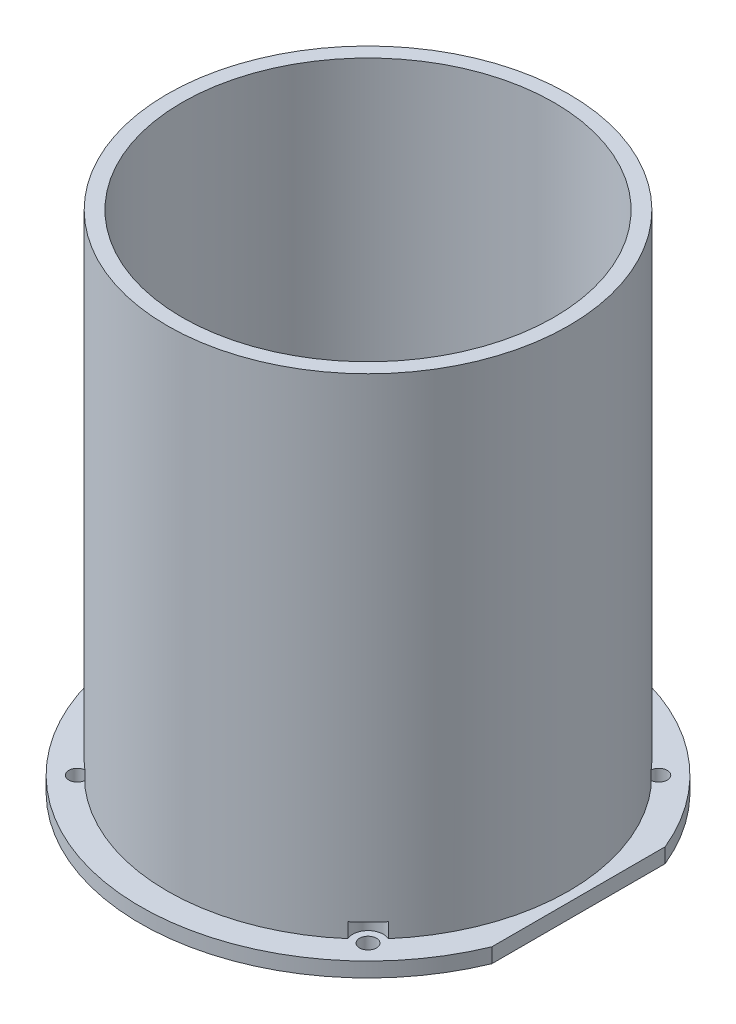
ISO-10303-21;
HEADER;
FILE_DESCRIPTION(('STEP AP214'),'2;1');
FILE_NAME('part.step','',(''),(''),'','','');
FILE_SCHEMA(('AUTOMOTIVE_DESIGN { 1 0 10303 214 1 1 1 1 }'));
ENDSEC;
DATA;
#1=APPLICATION_CONTEXT('core data for automotive mechanical design processes');
#2=APPLICATION_PROTOCOL_DEFINITION('international standard','automotive_design',2000,#1);
#3=PRODUCT_CONTEXT('',#1,'mechanical');
#4=PRODUCT('Part','Part','',(#3));
#5=PRODUCT_RELATED_PRODUCT_CATEGORY('part','',(#4));
#6=PRODUCT_DEFINITION_FORMATION('','',#4);
#7=PRODUCT_DEFINITION_CONTEXT('part definition',#1,'design');
#8=PRODUCT_DEFINITION('design','',#6,#7);
#9=PRODUCT_DEFINITION_SHAPE('','',#8);
#10=(LENGTH_UNIT() NAMED_UNIT(*) SI_UNIT(.MILLI.,.METRE.));
#11=(NAMED_UNIT(*) PLANE_ANGLE_UNIT() SI_UNIT($,.RADIAN.));
#12=(NAMED_UNIT(*) SI_UNIT($,.STERADIAN.) SOLID_ANGLE_UNIT());
#13=UNCERTAINTY_MEASURE_WITH_UNIT(LENGTH_MEASURE(1.E-05),#10,'distance_accuracy_value','');
#14=(GEOMETRIC_REPRESENTATION_CONTEXT(3) GLOBAL_UNCERTAINTY_ASSIGNED_CONTEXT((#13)) GLOBAL_UNIT_ASSIGNED_CONTEXT((#10,
#11,#12)) REPRESENTATION_CONTEXT('',''));
#15=CARTESIAN_POINT('',(0.,0.,0.));
#16=DIRECTION('',(0.,0.,1.));
#17=DIRECTION('',(1.,0.,0.));
#18=AXIS2_PLACEMENT_3D('',#15,#16,#17);
#19=CARTESIAN_POINT('',(0.,3.,0.));
#20=DIRECTION('',(0.,-1.,0.));
#21=DIRECTION('',(0.,0.,-1.));
#22=AXIS2_PLACEMENT_3D('',#19,#20,#21);
#23=CYLINDRICAL_SURFACE('',#22,38.);
#24=CARTESIAN_POINT('',(0.,0.,0.));
#25=DIRECTION('',(0.,1.,0.));
#26=DIRECTION('',(0.,0.,1.));
#27=AXIS2_PLACEMENT_3D('',#24,#25,#26);
#28=CIRCLE('',#27,38.);
#29=CARTESIAN_POINT('',(0.,0.,38.));
#30=VERTEX_POINT('',#29);
#31=EDGE_CURVE('E173',#30,#30,#28,.T.);
#32=ORIENTED_EDGE('',*,*,#31,.F.);
#33=EDGE_LOOP('',(#32));
#34=FACE_BOUND('',#33,.T.);
#35=CARTESIAN_POINT('',(0.,103.,0.));
#36=DIRECTION('',(0.,1.,0.));
#37=DIRECTION('',(0.,0.,1.));
#38=AXIS2_PLACEMENT_3D('',#35,#36,#37);
#39=CIRCLE('',#38,38.);
#40=CARTESIAN_POINT('',(0.,103.,38.));
#41=VERTEX_POINT('',#40);
#42=EDGE_CURVE('E319',#41,#41,#39,.T.);
#43=ORIENTED_EDGE('',*,*,#42,.T.);
#44=EDGE_LOOP('',(#43));
#45=FACE_BOUND('',#44,.T.);
#46=DIRECTION('',(0.,1.,0.));
#47=VECTOR('',#46,1.);
#48=CARTESIAN_POINT('',(-25.4481576781255,4.5,-28.2204052201463));
#49=LINE('',#48,#47);
#50=CARTESIAN_POINT('',(-25.4481576781255,1.,-28.2204052201463));
#51=VERTEX_POINT('',#50);
#52=CARTESIAN_POINT('',(-25.4481576781255,8.,-28.2204052201463));
#53=VERTEX_POINT('',#52);
#54=EDGE_CURVE('E195',#51,#53,#49,.T.);
#55=ORIENTED_EDGE('',*,*,#54,.F.);
#56=CARTESIAN_POINT('',(0.,1.,0.));
#57=DIRECTION('',(0.,1.,0.));
#58=DIRECTION('',(0.,0.,1.));
#59=AXIS2_PLACEMENT_3D('',#56,#57,#58);
#60=CIRCLE('',#59,38.);
#61=CARTESIAN_POINT('',(-28.2204052201463,1.,-25.4481576781255));
#62=VERTEX_POINT('',#61);
#63=EDGE_CURVE('E198',#51,#62,#60,.T.);
#64=ORIENTED_EDGE('',*,*,#63,.T.);
#65=DIRECTION('',(0.,1.,0.));
#66=VECTOR('',#65,1.);
#67=CARTESIAN_POINT('',(-28.2204052201463,4.5,-25.4481576781255));
#68=LINE('',#67,#66);
#69=CARTESIAN_POINT('',(-28.2204052201463,8.,-25.4481576781255));
#70=VERTEX_POINT('',#69);
#71=EDGE_CURVE('E192',#70,#62,#68,.F.);
#72=ORIENTED_EDGE('',*,*,#71,.F.);
#73=CARTESIAN_POINT('',(0.,8.,0.));
#74=DIRECTION('',(0.,1.,0.));
#75=DIRECTION('',(0.,0.,1.));
#76=AXIS2_PLACEMENT_3D('',#73,#74,#75);
#77=CIRCLE('',#76,38.);
#78=EDGE_CURVE('E189',#53,#70,#77,.T.);
#79=ORIENTED_EDGE('',*,*,#78,.F.);
#80=EDGE_LOOP('',(#55,#64,#72,#79));
#81=FACE_BOUND('',#80,.T.);
#82=DIRECTION('',(0.,1.,0.));
#83=VECTOR('',#82,1.);
#84=CARTESIAN_POINT('',(28.2204052201464,4.5,-25.4481576781254));
#85=LINE('',#84,#83);
#86=CARTESIAN_POINT('',(28.2204052201464,1.,-25.4481576781254));
#87=VERTEX_POINT('',#86);
#88=CARTESIAN_POINT('',(28.2204052201464,8.,-25.4481576781254));
#89=VERTEX_POINT('',#88);
#90=EDGE_CURVE('E248',#87,#89,#85,.T.);
#91=ORIENTED_EDGE('',*,*,#90,.F.);
#92=CARTESIAN_POINT('',(0.,1.,0.));
#93=DIRECTION('',(0.,1.,0.));
#94=DIRECTION('',(0.,0.,1.));
#95=AXIS2_PLACEMENT_3D('',#92,#93,#94);
#96=CIRCLE('',#95,38.);
#97=CARTESIAN_POINT('',(25.4481576781256,1.,-28.2204052201462));
#98=VERTEX_POINT('',#97);
#99=EDGE_CURVE('E212',#87,#98,#96,.T.);
#100=ORIENTED_EDGE('',*,*,#99,.T.);
#101=DIRECTION('',(0.,1.,0.));
#102=VECTOR('',#101,1.);
#103=CARTESIAN_POINT('',(25.4481576781256,4.5,-28.2204052201462));
#104=LINE('',#103,#102);
#105=CARTESIAN_POINT('',(25.4481576781256,8.,-28.2204052201462));
#106=VERTEX_POINT('',#105);
#107=EDGE_CURVE('E245',#106,#98,#104,.F.);
#108=ORIENTED_EDGE('',*,*,#107,.F.);
#109=CARTESIAN_POINT('',(0.,8.,0.));
#110=DIRECTION('',(0.,1.,0.));
#111=DIRECTION('',(0.,0.,1.));
#112=AXIS2_PLACEMENT_3D('',#109,#110,#111);
#113=CIRCLE('',#112,38.);
#114=EDGE_CURVE('E209',#89,#106,#113,.T.);
#115=ORIENTED_EDGE('',*,*,#114,.F.);
#116=EDGE_LOOP('',(#91,#100,#108,#115));
#117=FACE_BOUND('',#116,.T.);
#118=DIRECTION('',(0.,1.,0.));
#119=VECTOR('',#118,1.);
#120=CARTESIAN_POINT('',(25.4481576781255,4.5,28.2204052201463));
#121=LINE('',#120,#119);
#122=CARTESIAN_POINT('',(25.4481576781255,1.,28.2204052201463));
#123=VERTEX_POINT('',#122);
#124=CARTESIAN_POINT('',(25.4481576781255,8.,28.2204052201463));
#125=VERTEX_POINT('',#124);
#126=EDGE_CURVE('E219',#123,#125,#121,.T.);
#127=ORIENTED_EDGE('',*,*,#126,.F.);
#128=CARTESIAN_POINT('',(0.,1.,0.));
#129=DIRECTION('',(0.,1.,0.));
#130=DIRECTION('',(0.,0.,1.));
#131=AXIS2_PLACEMENT_3D('',#128,#129,#130);
#132=CIRCLE('',#131,38.);
#133=CARTESIAN_POINT('',(28.2204052201463,1.,25.4481576781255));
#134=VERTEX_POINT('',#133);
#135=EDGE_CURVE('E42',#123,#134,#132,.T.);
#136=ORIENTED_EDGE('',*,*,#135,.T.);
#137=DIRECTION('',(0.,1.,0.));
#138=VECTOR('',#137,1.);
#139=CARTESIAN_POINT('',(28.2204052201463,4.5,25.4481576781255));
#140=LINE('',#139,#138);
#141=CARTESIAN_POINT('',(28.2204052201463,8.,25.4481576781255));
#142=VERTEX_POINT('',#141);
#143=EDGE_CURVE('E216',#142,#134,#140,.F.);
#144=ORIENTED_EDGE('',*,*,#143,.F.);
#145=CARTESIAN_POINT('',(0.,8.,0.));
#146=DIRECTION('',(0.,1.,0.));
#147=DIRECTION('',(0.,0.,1.));
#148=AXIS2_PLACEMENT_3D('',#145,#146,#147);
#149=CIRCLE('',#148,38.);
#150=EDGE_CURVE('E237',#125,#142,#149,.T.);
#151=ORIENTED_EDGE('',*,*,#150,.F.);
#152=EDGE_LOOP('',(#127,#136,#144,#151));
#153=FACE_BOUND('',#152,.T.);
#154=DIRECTION('',(0.,1.,0.));
#155=VECTOR('',#154,1.);
#156=CARTESIAN_POINT('',(-28.2204052201466,4.5,25.4481576781252));
#157=LINE('',#156,#155);
#158=CARTESIAN_POINT('',(-28.2204052201466,1.,25.4481576781252));
#159=VERTEX_POINT('',#158);
#160=CARTESIAN_POINT('',(-28.2204052201466,8.,25.4481576781252));
#161=VERTEX_POINT('',#160);
#162=EDGE_CURVE('E56',#159,#161,#157,.T.);
#163=ORIENTED_EDGE('',*,*,#162,.F.);
#164=CARTESIAN_POINT('',(0.,1.,0.));
#165=DIRECTION('',(0.,1.,0.));
#166=DIRECTION('',(0.,0.,1.));
#167=AXIS2_PLACEMENT_3D('',#164,#165,#166);
#168=CIRCLE('',#167,38.);
#169=CARTESIAN_POINT('',(-25.4481576781258,1.,28.2204052201461));
#170=VERTEX_POINT('',#169);
#171=EDGE_CURVE('E11',#159,#170,#168,.T.);
#172=ORIENTED_EDGE('',*,*,#171,.T.);
#173=DIRECTION('',(0.,1.,0.));
#174=VECTOR('',#173,1.);
#175=CARTESIAN_POINT('',(-25.4481576781258,4.5,28.2204052201461));
#176=LINE('',#175,#174);
#177=CARTESIAN_POINT('',(-25.4481576781258,8.,28.2204052201461));
#178=VERTEX_POINT('',#177);
#179=EDGE_CURVE('E695',#178,#170,#176,.F.);
#180=ORIENTED_EDGE('',*,*,#179,.F.);
#181=CARTESIAN_POINT('',(0.,8.,0.));
#182=DIRECTION('',(0.,1.,0.));
#183=DIRECTION('',(0.,0.,1.));
#184=AXIS2_PLACEMENT_3D('',#181,#182,#183);
#185=CIRCLE('',#184,38.);
#186=EDGE_CURVE('E232',#161,#178,#185,.T.);
#187=ORIENTED_EDGE('',*,*,#186,.F.);
#188=EDGE_LOOP('',(#163,#172,#180,#187));
#189=FACE_BOUND('',#188,.T.);
#190=ADVANCED_FACE('F34',(#34,#45,#81,#117,#153,#189),#23,.F.);
#191=CARTESIAN_POINT('',(0.,103.,0.));
#192=DIRECTION('',(0.,-1.,0.));
#193=DIRECTION('',(0.,0.,-1.));
#194=AXIS2_PLACEMENT_3D('',#191,#192,#193);
#195=CYLINDRICAL_SURFACE('',#194,41.);
#196=DIRECTION('',(0.,-1.,0.));
#197=VECTOR('',#196,1.);
#198=CARTESIAN_POINT('',(-30.984716795134,4.5,26.8504622888572));
#199=LINE('',#198,#197);
#200=CARTESIAN_POINT('',(-30.984716795134,6.,26.8504622888572));
#201=VERTEX_POINT('',#200);
#202=CARTESIAN_POINT('',(-30.984716795134,3.,26.8504622888572));
#203=VERTEX_POINT('',#202);
#204=EDGE_CURVE('E271',#201,#203,#199,.T.);
#205=ORIENTED_EDGE('',*,*,#204,.F.);
#206=CARTESIAN_POINT('',(0.,6.00000000000001,0.));
#207=DIRECTION('',(0.,1.,0.));
#208=DIRECTION('',(0.,0.,1.));
#209=AXIS2_PLACEMENT_3D('',#206,#207,#208);
#210=CIRCLE('',#209,41.);
#211=CARTESIAN_POINT('',(-26.8504622888579,6.,30.9847167951334));
#212=VERTEX_POINT('',#211);
#213=EDGE_CURVE('E200',#201,#212,#210,.T.);
#214=ORIENTED_EDGE('',*,*,#213,.T.);
#215=DIRECTION('',(0.,-1.,0.));
#216=VECTOR('',#215,1.);
#217=CARTESIAN_POINT('',(-26.8504622888579,4.5,30.9847167951334));
#218=LINE('',#217,#216);
#219=CARTESIAN_POINT('',(-26.8504622888579,3.,30.9847167951334));
#220=VERTEX_POINT('',#219);
#221=EDGE_CURVE('E255',#220,#212,#218,.F.);
#222=ORIENTED_EDGE('',*,*,#221,.F.);
#223=CARTESIAN_POINT('',(0.,3.,0.));
#224=DIRECTION('',(0.,1.,0.));
#225=DIRECTION('',(0.,0.,1.));
#226=AXIS2_PLACEMENT_3D('',#223,#224,#225);
#227=CIRCLE('',#226,41.);
#228=CARTESIAN_POINT('',(26.8504622888576,3.,30.9847167951337));
#229=VERTEX_POINT('',#228);
#230=EDGE_CURVE('E325',#220,#229,#227,.T.);
#231=ORIENTED_EDGE('',*,*,#230,.T.);
#232=DIRECTION('',(0.,-1.,0.));
#233=VECTOR('',#232,1.);
#234=CARTESIAN_POINT('',(26.8504622888576,4.5,30.9847167951337));
#235=LINE('',#234,#233);
#236=CARTESIAN_POINT('',(26.8504622888576,6.,30.9847167951337));
#237=VERTEX_POINT('',#236);
#238=EDGE_CURVE('E276',#237,#229,#235,.T.);
#239=ORIENTED_EDGE('',*,*,#238,.F.);
#240=CARTESIAN_POINT('',(0.,6.00000000000001,0.));
#241=DIRECTION('',(0.,1.,0.));
#242=DIRECTION('',(0.,0.,1.));
#243=AXIS2_PLACEMENT_3D('',#240,#241,#242);
#244=CIRCLE('',#243,41.);
#245=CARTESIAN_POINT('',(30.9847167951337,6.,26.8504622888576));
#246=VERTEX_POINT('',#245);
#247=EDGE_CURVE('E203',#237,#246,#244,.T.);
#248=ORIENTED_EDGE('',*,*,#247,.T.);
#249=DIRECTION('',(0.,-1.,0.));
#250=VECTOR('',#249,1.);
#251=CARTESIAN_POINT('',(30.9847167951337,4.5,26.8504622888576));
#252=LINE('',#251,#250);
#253=CARTESIAN_POINT('',(30.9847167951337,3.,26.8504622888576));
#254=VERTEX_POINT('',#253);
#255=EDGE_CURVE('E274',#254,#246,#252,.F.);
#256=ORIENTED_EDGE('',*,*,#255,.F.);
#257=CARTESIAN_POINT('',(30.9847167951338,3.,-26.8504622888574));
#258=VERTEX_POINT('',#257);
#259=EDGE_CURVE('E326',#254,#258,#227,.T.);
#260=ORIENTED_EDGE('',*,*,#259,.T.);
#261=DIRECTION('',(0.,-1.,0.));
#262=VECTOR('',#261,1.);
#263=CARTESIAN_POINT('',(30.9847167951338,4.5,-26.8504622888574));
#264=LINE('',#263,#262);
#265=CARTESIAN_POINT('',(30.9847167951338,6.,-26.8504622888574));
#266=VERTEX_POINT('',#265);
#267=EDGE_CURVE('E281',#266,#258,#264,.T.);
#268=ORIENTED_EDGE('',*,*,#267,.F.);
#269=CARTESIAN_POINT('',(0.,6.00000000000001,0.));
#270=DIRECTION('',(0.,1.,0.));
#271=DIRECTION('',(0.,0.,1.));
#272=AXIS2_PLACEMENT_3D('',#269,#270,#271);
#273=CIRCLE('',#272,41.);
#274=CARTESIAN_POINT('',(26.8504622888577,6.,-30.9847167951336));
#275=VERTEX_POINT('',#274);
#276=EDGE_CURVE('E206',#266,#275,#273,.T.);
#277=ORIENTED_EDGE('',*,*,#276,.T.);
#278=DIRECTION('',(0.,-1.,0.));
#279=VECTOR('',#278,1.);
#280=CARTESIAN_POINT('',(26.8504622888577,4.5,-30.9847167951336));
#281=LINE('',#280,#279);
#282=CARTESIAN_POINT('',(26.8504622888577,3.,-30.9847167951336));
#283=VERTEX_POINT('',#282);
#284=EDGE_CURVE('E279',#283,#275,#281,.F.);
#285=ORIENTED_EDGE('',*,*,#284,.F.);
#286=CARTESIAN_POINT('',(-26.8504622888576,3.,-30.9847167951337));
#287=VERTEX_POINT('',#286);
#288=EDGE_CURVE('E331',#283,#287,#227,.T.);
#289=ORIENTED_EDGE('',*,*,#288,.T.);
#290=DIRECTION('',(0.,-1.,0.));
#291=VECTOR('',#290,1.);
#292=CARTESIAN_POINT('',(-26.8504622888576,4.5,-30.9847167951337));
#293=LINE('',#292,#291);
#294=CARTESIAN_POINT('',(-26.8504622888576,6.,-30.9847167951337));
#295=VERTEX_POINT('',#294);
#296=EDGE_CURVE('E186',#295,#287,#293,.T.);
#297=ORIENTED_EDGE('',*,*,#296,.F.);
#298=CARTESIAN_POINT('',(0.,6.00000000000001,0.));
#299=DIRECTION('',(0.,1.,0.));
#300=DIRECTION('',(0.,0.,1.));
#301=AXIS2_PLACEMENT_3D('',#298,#299,#300);
#302=CIRCLE('',#301,41.);
#303=CARTESIAN_POINT('',(-30.9847167951337,6.,-26.8504622888576));
#304=VERTEX_POINT('',#303);
#305=EDGE_CURVE('E181',#295,#304,#302,.T.);
#306=ORIENTED_EDGE('',*,*,#305,.T.);
#307=DIRECTION('',(0.,-1.,0.));
#308=VECTOR('',#307,1.);
#309=CARTESIAN_POINT('',(-30.9847167951337,4.5,-26.8504622888576));
#310=LINE('',#309,#308);
#311=CARTESIAN_POINT('',(-30.9847167951337,3.,-26.8504622888576));
#312=VERTEX_POINT('',#311);
#313=EDGE_CURVE('E184',#312,#304,#310,.F.);
#314=ORIENTED_EDGE('',*,*,#313,.F.);
#315=EDGE_CURVE('E322',#312,#203,#227,.T.);
#316=ORIENTED_EDGE('',*,*,#315,.T.);
#317=EDGE_LOOP('',(#205,#214,#222,#231,#239,#248,#256,#260,#268,#277,#285,#289,#297,#306,#314,#316));
#318=FACE_BOUND('',#317,.T.);
#319=CARTESIAN_POINT('',(0.,103.,0.));
#320=DIRECTION('',(0.,1.,0.));
#321=DIRECTION('',(0.,0.,1.));
#322=AXIS2_PLACEMENT_3D('',#319,#320,#321);
#323=CIRCLE('',#322,41.);
#324=CARTESIAN_POINT('',(0.,103.,41.));
#325=VERTEX_POINT('',#324);
#326=EDGE_CURVE('E178',#325,#325,#323,.T.);
#327=ORIENTED_EDGE('',*,*,#326,.F.);
#328=EDGE_LOOP('',(#327));
#329=FACE_BOUND('',#328,.T.);
#330=ADVANCED_FACE('F338',(#318,#329),#195,.T.);
#331=CARTESIAN_POINT('',(0.,3.,0.));
#332=DIRECTION('',(0.,1.,0.));
#333=DIRECTION('',(0.,0.,1.));
#334=AXIS2_PLACEMENT_3D('',#331,#332,#333);
#335=PLANE('',#334);
#336=DIRECTION('',(0.,0.,1.));
#337=VECTOR('',#336,1.);
#338=CARTESIAN_POINT('',(43.,3.,17.6988700204279));
#339=LINE('',#338,#337);
#340=CARTESIAN_POINT('',(43.,3.,-17.6988700204279));
#341=VERTEX_POINT('',#340);
#342=CARTESIAN_POINT('',(43.,3.,17.6988700204279));
#343=VERTEX_POINT('',#342);
#344=EDGE_CURVE('E49',#341,#343,#339,.T.);
#345=ORIENTED_EDGE('',*,*,#344,.F.);
#346=CARTESIAN_POINT('',(0.,3.,0.));
#347=DIRECTION('',(0.,1.,0.));
#348=DIRECTION('',(0.,0.,1.));
#349=AXIS2_PLACEMENT_3D('',#346,#347,#348);
#350=CIRCLE('',#349,46.5);
#351=EDGE_CURVE('E169',#341,#343,#350,.T.);
#352=ORIENTED_EDGE('',*,*,#351,.T.);
#353=EDGE_LOOP('',(#345,#352));
#354=FACE_BOUND('',#353,.T.);
#355=CARTESIAN_POINT('',(29.698484809835,3.,-29.698484809835));
#356=DIRECTION('',(0.,1.,0.));
#357=DIRECTION('',(0.,0.,1.));
#358=AXIS2_PLACEMENT_3D('',#355,#356,#357);
#359=CIRCLE('',#358,1.7272);
#360=CARTESIAN_POINT('',(29.698484809835,3.,-27.971284809835));
#361=VERTEX_POINT('',#360);
#362=EDGE_CURVE('E302',#361,#361,#359,.T.);
#363=ORIENTED_EDGE('',*,*,#362,.F.);
#364=EDGE_LOOP('',(#363));
#365=FACE_BOUND('',#364,.T.);
#366=ORIENTED_EDGE('',*,*,#259,.F.);
#367=CARTESIAN_POINT('',(29.698484809835,3.,29.698484809835));
#368=DIRECTION('',(0.,1.,0.));
#369=DIRECTION('',(0.,0.,-1.));
#370=AXIS2_PLACEMENT_3D('',#367,#368,#369);
#371=CIRCLE('',#370,3.125);
#372=EDGE_CURVE('E262',#254,#229,#371,.T.);
#373=ORIENTED_EDGE('',*,*,#372,.T.);
#374=ORIENTED_EDGE('',*,*,#230,.F.);
#375=CARTESIAN_POINT('',(-29.6984848098353,3.,29.6984848098347));
#376=DIRECTION('',(0.,1.,0.));
#377=DIRECTION('',(1.,0.,0.));
#378=AXIS2_PLACEMENT_3D('',#375,#376,#377);
#379=CIRCLE('',#378,3.125);
#380=EDGE_CURVE('E251',#220,#203,#379,.T.);
#381=ORIENTED_EDGE('',*,*,#380,.T.);
#382=ORIENTED_EDGE('',*,*,#315,.F.);
#383=CARTESIAN_POINT('',(-29.698484809835,3.,-29.698484809835));
#384=DIRECTION('',(0.,1.,0.));
#385=DIRECTION('',(0.,0.,1.));
#386=AXIS2_PLACEMENT_3D('',#383,#384,#385);
#387=CIRCLE('',#386,3.125);
#388=EDGE_CURVE('E290',#312,#287,#387,.T.);
#389=ORIENTED_EDGE('',*,*,#388,.T.);
#390=ORIENTED_EDGE('',*,*,#288,.F.);
#391=CARTESIAN_POINT('',(29.6984848098351,3.,-29.6984848098349));
#392=DIRECTION('',(0.,1.,0.));
#393=DIRECTION('',(-1.,0.,0.));
#394=AXIS2_PLACEMENT_3D('',#391,#392,#393);
#395=CIRCLE('',#394,3.125);
#396=EDGE_CURVE('E256',#283,#258,#395,.T.);
#397=ORIENTED_EDGE('',*,*,#396,.T.);
#398=EDGE_LOOP('',(#366,#373,#374,#381,#382,#389,#390,#397));
#399=FACE_BOUND('',#398,.T.);
#400=CARTESIAN_POINT('',(-29.698484809835,3.,29.698484809835));
#401=DIRECTION('',(0.,1.,0.));
#402=DIRECTION('',(0.,0.,1.));
#403=AXIS2_PLACEMENT_3D('',#400,#401,#402);
#404=CIRCLE('',#403,1.7272);
#405=CARTESIAN_POINT('',(-29.698484809835,3.,31.425684809835));
#406=VERTEX_POINT('',#405);
#407=EDGE_CURVE('E175',#406,#406,#404,.T.);
#408=ORIENTED_EDGE('',*,*,#407,.F.);
#409=EDGE_LOOP('',(#408));
#410=FACE_BOUND('',#409,.T.);
#411=CARTESIAN_POINT('',(29.698484809835,3.,29.698484809835));
#412=DIRECTION('',(0.,1.,0.));
#413=DIRECTION('',(0.,0.,1.));
#414=AXIS2_PLACEMENT_3D('',#411,#412,#413);
#415=CIRCLE('',#414,1.7272);
#416=CARTESIAN_POINT('',(29.698484809835,3.,31.425684809835));
#417=VERTEX_POINT('',#416);
#418=EDGE_CURVE('E308',#417,#417,#415,.T.);
#419=ORIENTED_EDGE('',*,*,#418,.F.);
#420=EDGE_LOOP('',(#419));
#421=FACE_BOUND('',#420,.T.);
#422=CARTESIAN_POINT('',(-29.698484809835,3.,-29.698484809835));
#423=DIRECTION('',(0.,1.,0.));
#424=DIRECTION('',(0.,0.,1.));
#425=AXIS2_PLACEMENT_3D('',#422,#423,#424);
#426=CIRCLE('',#425,1.7272);
#427=CARTESIAN_POINT('',(-29.698484809835,3.,-27.971284809835));
#428=VERTEX_POINT('',#427);
#429=EDGE_CURVE('E294',#428,#428,#426,.T.);
#430=ORIENTED_EDGE('',*,*,#429,.F.);
#431=EDGE_LOOP('',(#430));
#432=FACE_BOUND('',#431,.T.);
#433=ADVANCED_FACE('F345',(#354,#365,#399,#410,#421,#432),#335,.T.);
#434=CARTESIAN_POINT('',(0.,0.,0.));
#435=DIRECTION('',(0.,1.,0.));
#436=DIRECTION('',(0.,0.,1.));
#437=AXIS2_PLACEMENT_3D('',#434,#435,#436);
#438=PLANE('',#437);
#439=CARTESIAN_POINT('',(-29.698484809835,0.,-29.698484809835));
#440=DIRECTION('',(0.,1.,0.));
#441=DIRECTION('',(0.,0.,1.));
#442=AXIS2_PLACEMENT_3D('',#439,#440,#441);
#443=CIRCLE('',#442,1.7272);
#444=CARTESIAN_POINT('',(-29.698484809835,0.,-27.971284809835));
#445=VERTEX_POINT('',#444);
#446=EDGE_CURVE('E299',#445,#445,#443,.T.);
#447=ORIENTED_EDGE('',*,*,#446,.T.);
#448=EDGE_LOOP('',(#447));
#449=FACE_BOUND('',#448,.T.);
#450=CARTESIAN_POINT('',(29.698484809835,0.,-29.698484809835));
#451=DIRECTION('',(0.,1.,0.));
#452=DIRECTION('',(0.,0.,1.));
#453=AXIS2_PLACEMENT_3D('',#450,#451,#452);
#454=CIRCLE('',#453,1.7272);
#455=CARTESIAN_POINT('',(29.698484809835,0.,-27.971284809835));
#456=VERTEX_POINT('',#455);
#457=EDGE_CURVE('E305',#456,#456,#454,.T.);
#458=ORIENTED_EDGE('',*,*,#457,.T.);
#459=EDGE_LOOP('',(#458));
#460=FACE_BOUND('',#459,.T.);
#461=CARTESIAN_POINT('',(29.698484809835,0.,29.698484809835));
#462=DIRECTION('',(0.,1.,0.));
#463=DIRECTION('',(0.,0.,1.));
#464=AXIS2_PLACEMENT_3D('',#461,#462,#463);
#465=CIRCLE('',#464,1.7272);
#466=CARTESIAN_POINT('',(29.698484809835,0.,31.425684809835));
#467=VERTEX_POINT('',#466);
#468=EDGE_CURVE('E311',#467,#467,#465,.T.);
#469=ORIENTED_EDGE('',*,*,#468,.T.);
#470=EDGE_LOOP('',(#469));
#471=FACE_BOUND('',#470,.T.);
#472=CARTESIAN_POINT('',(-29.698484809835,0.,29.698484809835));
#473=DIRECTION('',(0.,1.,0.));
#474=DIRECTION('',(0.,0.,1.));
#475=AXIS2_PLACEMENT_3D('',#472,#473,#474);
#476=CIRCLE('',#475,1.7272);
#477=CARTESIAN_POINT('',(-29.698484809835,0.,31.425684809835));
#478=VERTEX_POINT('',#477);
#479=EDGE_CURVE('E314',#478,#478,#476,.T.);
#480=ORIENTED_EDGE('',*,*,#479,.T.);
#481=EDGE_LOOP('',(#480));
#482=FACE_BOUND('',#481,.T.);
#483=CARTESIAN_POINT('',(0.,0.,0.));
#484=DIRECTION('',(0.,1.,0.));
#485=DIRECTION('',(0.,0.,1.));
#486=AXIS2_PLACEMENT_3D('',#483,#484,#485);
#487=CIRCLE('',#486,46.5);
#488=CARTESIAN_POINT('',(43.,0.,-17.6988700204279));
#489=VERTEX_POINT('',#488);
#490=CARTESIAN_POINT('',(43.,0.,17.6988700204279));
#491=VERTEX_POINT('',#490);
#492=EDGE_CURVE('E167',#489,#491,#487,.T.);
#493=ORIENTED_EDGE('',*,*,#492,.F.);
#494=DIRECTION('',(0.,0.,1.));
#495=VECTOR('',#494,1.);
#496=CARTESIAN_POINT('',(43.,0.,17.6988700204279));
#497=LINE('',#496,#495);
#498=EDGE_CURVE('E156',#489,#491,#497,.T.);
#499=ORIENTED_EDGE('',*,*,#498,.T.);
#500=EDGE_LOOP('',(#493,#499));
#501=FACE_BOUND('',#500,.T.);
#502=ORIENTED_EDGE('',*,*,#31,.T.);
#503=EDGE_LOOP('',(#502));
#504=FACE_BOUND('',#503,.T.);
#505=ADVANCED_FACE('F171',(#449,#460,#471,#482,#501,#504),#438,.F.);
#506=CARTESIAN_POINT('',(0.,3.,0.));
#507=DIRECTION('',(0.,-1.,0.));
#508=DIRECTION('',(0.,0.,-1.));
#509=AXIS2_PLACEMENT_3D('',#506,#507,#508);
#510=CYLINDRICAL_SURFACE('',#509,46.5);
#511=ORIENTED_EDGE('',*,*,#351,.F.);
#512=DIRECTION('',(0.,1.,0.));
#513=VECTOR('',#512,1.);
#514=CARTESIAN_POINT('',(43.,0.,-17.6988700204279));
#515=LINE('',#514,#513);
#516=EDGE_CURVE('E159',#489,#341,#515,.T.);
#517=ORIENTED_EDGE('',*,*,#516,.F.);
#518=ORIENTED_EDGE('',*,*,#492,.T.);
#519=DIRECTION('',(0.,1.,0.));
#520=VECTOR('',#519,1.);
#521=CARTESIAN_POINT('',(43.,0.,17.6988700204279));
#522=LINE('',#521,#520);
#523=EDGE_CURVE('E160',#491,#343,#522,.T.);
#524=ORIENTED_EDGE('',*,*,#523,.T.);
#525=EDGE_LOOP('',(#511,#517,#518,#524));
#526=FACE_BOUND('',#525,.T.);
#527=ADVANCED_FACE('F36',(#526),#510,.T.);
#528=CARTESIAN_POINT('',(0.,103.,0.));
#529=DIRECTION('',(0.,1.,0.));
#530=DIRECTION('',(0.,0.,1.));
#531=AXIS2_PLACEMENT_3D('',#528,#529,#530);
#532=PLANE('',#531);
#533=ORIENTED_EDGE('',*,*,#326,.T.);
#534=EDGE_LOOP('',(#533));
#535=FACE_BOUND('',#534,.T.);
#536=ORIENTED_EDGE('',*,*,#42,.F.);
#537=EDGE_LOOP('',(#536));
#538=FACE_BOUND('',#537,.T.);
#539=ADVANCED_FACE('F382',(#535,#538),#532,.T.);
#540=CARTESIAN_POINT('',(-29.698484809835,3.,29.698484809835));
#541=DIRECTION('',(0.,1.,0.));
#542=DIRECTION('',(0.,0.,1.));
#543=AXIS2_PLACEMENT_3D('',#540,#541,#542);
#544=CYLINDRICAL_SURFACE('',#543,1.7272);
#545=ORIENTED_EDGE('',*,*,#479,.F.);
#546=EDGE_LOOP('',(#545));
#547=FACE_BOUND('',#546,.T.);
#548=ORIENTED_EDGE('',*,*,#407,.T.);
#549=EDGE_LOOP('',(#548));
#550=FACE_BOUND('',#549,.T.);
#551=ADVANCED_FACE('F391',(#547,#550),#544,.F.);
#552=CARTESIAN_POINT('',(29.698484809835,3.,29.698484809835));
#553=DIRECTION('',(0.,1.,0.));
#554=DIRECTION('',(0.,0.,1.));
#555=AXIS2_PLACEMENT_3D('',#552,#553,#554);
#556=CYLINDRICAL_SURFACE('',#555,1.7272);
#557=ORIENTED_EDGE('',*,*,#468,.F.);
#558=EDGE_LOOP('',(#557));
#559=FACE_BOUND('',#558,.T.);
#560=ORIENTED_EDGE('',*,*,#418,.T.);
#561=EDGE_LOOP('',(#560));
#562=FACE_BOUND('',#561,.T.);
#563=ADVANCED_FACE('F394',(#559,#562),#556,.F.);
#564=CARTESIAN_POINT('',(29.698484809835,3.,-29.698484809835));
#565=DIRECTION('',(0.,1.,0.));
#566=DIRECTION('',(0.,0.,1.));
#567=AXIS2_PLACEMENT_3D('',#564,#565,#566);
#568=CYLINDRICAL_SURFACE('',#567,1.7272);
#569=ORIENTED_EDGE('',*,*,#457,.F.);
#570=EDGE_LOOP('',(#569));
#571=FACE_BOUND('',#570,.T.);
#572=ORIENTED_EDGE('',*,*,#362,.T.);
#573=EDGE_LOOP('',(#572));
#574=FACE_BOUND('',#573,.T.);
#575=ADVANCED_FACE('F404',(#571,#574),#568,.F.);
#576=CARTESIAN_POINT('',(-29.698484809835,3.,-29.698484809835));
#577=DIRECTION('',(0.,1.,0.));
#578=DIRECTION('',(0.,0.,1.));
#579=AXIS2_PLACEMENT_3D('',#576,#577,#578);
#580=CYLINDRICAL_SURFACE('',#579,1.7272);
#581=ORIENTED_EDGE('',*,*,#446,.F.);
#582=EDGE_LOOP('',(#581));
#583=FACE_BOUND('',#582,.T.);
#584=ORIENTED_EDGE('',*,*,#429,.T.);
#585=EDGE_LOOP('',(#584));
#586=FACE_BOUND('',#585,.T.);
#587=ADVANCED_FACE('F402',(#583,#586),#580,.F.);
#588=CARTESIAN_POINT('',(-29.698484809835,6.,-29.698484809835));
#589=DIRECTION('',(0.,-1.,0.));
#590=DIRECTION('',(0.,0.,-1.));
#591=AXIS2_PLACEMENT_3D('',#588,#589,#590);
#592=CYLINDRICAL_SURFACE('',#591,3.125);
#593=ORIENTED_EDGE('',*,*,#296,.T.);
#594=ORIENTED_EDGE('',*,*,#388,.F.);
#595=ORIENTED_EDGE('',*,*,#313,.T.);
#596=CARTESIAN_POINT('',(-29.698484809835,6.,-29.698484809835));
#597=DIRECTION('',(0.,1.,0.));
#598=DIRECTION('',(0.,0.,1.));
#599=AXIS2_PLACEMENT_3D('',#596,#597,#598);
#600=CIRCLE('',#599,3.125);
#601=EDGE_CURVE('E291',#304,#295,#600,.T.);
#602=ORIENTED_EDGE('',*,*,#601,.T.);
#603=EDGE_LOOP('',(#593,#594,#595,#602));
#604=FACE_BOUND('',#603,.T.);
#605=ADVANCED_FACE('F342',(#604),#592,.F.);
#606=CARTESIAN_POINT('',(-29.698484809835,6.,-29.698484809835));
#607=DIRECTION('',(0.,1.,0.));
#608=DIRECTION('',(0.,0.,1.));
#609=AXIS2_PLACEMENT_3D('',#606,#607,#608);
#610=PLANE('',#609);
#611=ORIENTED_EDGE('',*,*,#601,.F.);
#612=ORIENTED_EDGE('',*,*,#305,.F.);
#613=EDGE_LOOP('',(#611,#612));
#614=FACE_BOUND('',#613,.T.);
#615=ADVANCED_FACE('F411',(#614),#610,.F.);
#616=CARTESIAN_POINT('',(-14.8492424049175,1.,-14.8492424049175));
#617=DIRECTION('',(0.,1.,0.));
#618=DIRECTION('',(0.,0.,1.));
#619=AXIS2_PLACEMENT_3D('',#616,#617,#618);
#620=PLANE('',#619);
#621=ORIENTED_EDGE('',*,*,#63,.F.);
#622=CARTESIAN_POINT('',(-29.698484809835,1.,-29.698484809835));
#623=DIRECTION('',(0.,1.,0.));
#624=DIRECTION('',(0.,0.,1.));
#625=AXIS2_PLACEMENT_3D('',#622,#623,#624);
#626=CIRCLE('',#625,4.5);
#627=EDGE_CURVE('E287',#62,#51,#626,.T.);
#628=ORIENTED_EDGE('',*,*,#627,.F.);
#629=EDGE_LOOP('',(#621,#628));
#630=FACE_BOUND('',#629,.T.);
#631=ADVANCED_FACE('F626',(#630),#620,.F.);
#632=CARTESIAN_POINT('',(-14.8492424049175,8.,-14.8492424049175));
#633=DIRECTION('',(0.,1.,0.));
#634=DIRECTION('',(0.,0.,1.));
#635=AXIS2_PLACEMENT_3D('',#632,#633,#634);
#636=PLANE('',#635);
#637=CARTESIAN_POINT('',(-29.698484809835,8.,-29.698484809835));
#638=DIRECTION('',(0.,1.,0.));
#639=DIRECTION('',(0.,0.,1.));
#640=AXIS2_PLACEMENT_3D('',#637,#638,#639);
#641=CIRCLE('',#640,4.5);
#642=EDGE_CURVE('E284',#70,#53,#641,.T.);
#643=ORIENTED_EDGE('',*,*,#642,.T.);
#644=ORIENTED_EDGE('',*,*,#78,.T.);
#645=EDGE_LOOP('',(#643,#644));
#646=FACE_BOUND('',#645,.T.);
#647=ADVANCED_FACE('F635',(#646),#636,.T.);
#648=CARTESIAN_POINT('',(-29.698484809835,1.,-29.698484809835));
#649=DIRECTION('',(0.,1.,0.));
#650=DIRECTION('',(0.,0.,1.));
#651=AXIS2_PLACEMENT_3D('',#648,#649,#650);
#652=CYLINDRICAL_SURFACE('',#651,4.5);
#653=ORIENTED_EDGE('',*,*,#627,.T.);
#654=ORIENTED_EDGE('',*,*,#54,.T.);
#655=ORIENTED_EDGE('',*,*,#642,.F.);
#656=ORIENTED_EDGE('',*,*,#71,.T.);
#657=EDGE_LOOP('',(#653,#654,#655,#656));
#658=FACE_BOUND('',#657,.T.);
#659=ADVANCED_FACE('F452',(#658),#652,.T.);
#660=CARTESIAN_POINT('',(29.6984848098351,6.,-29.6984848098349));
#661=DIRECTION('',(0.,1.,0.));
#662=DIRECTION('',(-1.,0.,0.));
#663=AXIS2_PLACEMENT_3D('',#660,#661,#662);
#664=PLANE('',#663);
#665=CARTESIAN_POINT('',(29.6984848098351,6.,-29.6984848098349));
#666=DIRECTION('',(0.,1.,0.));
#667=DIRECTION('',(-1.,0.,0.));
#668=AXIS2_PLACEMENT_3D('',#665,#666,#667);
#669=CIRCLE('',#668,3.125);
#670=EDGE_CURVE('E252',#275,#266,#669,.T.);
#671=ORIENTED_EDGE('',*,*,#670,.F.);
#672=ORIENTED_EDGE('',*,*,#276,.F.);
#673=EDGE_LOOP('',(#671,#672));
#674=FACE_BOUND('',#673,.T.);
#675=ADVANCED_FACE('F448',(#674),#664,.F.);
#676=CARTESIAN_POINT('',(29.6984848098351,6.,-29.6984848098349));
#677=DIRECTION('',(0.,-1.,0.));
#678=DIRECTION('',(0.,0.,-1.));
#679=AXIS2_PLACEMENT_3D('',#676,#677,#678);
#680=CYLINDRICAL_SURFACE('',#679,3.125);
#681=ORIENTED_EDGE('',*,*,#267,.T.);
#682=ORIENTED_EDGE('',*,*,#396,.F.);
#683=ORIENTED_EDGE('',*,*,#284,.T.);
#684=ORIENTED_EDGE('',*,*,#670,.T.);
#685=EDGE_LOOP('',(#681,#682,#683,#684));
#686=FACE_BOUND('',#685,.T.);
#687=ADVANCED_FACE('F451',(#686),#680,.F.);
#688=CARTESIAN_POINT('',(29.698484809835,6.,29.698484809835));
#689=DIRECTION('',(0.,1.,0.));
#690=DIRECTION('',(0.,0.,-1.));
#691=AXIS2_PLACEMENT_3D('',#688,#689,#690);
#692=PLANE('',#691);
#693=CARTESIAN_POINT('',(29.698484809835,6.,29.698484809835));
#694=DIRECTION('',(0.,1.,0.));
#695=DIRECTION('',(0.,0.,-1.));
#696=AXIS2_PLACEMENT_3D('',#693,#694,#695);
#697=CIRCLE('',#696,3.125);
#698=EDGE_CURVE('E259',#246,#237,#697,.T.);
#699=ORIENTED_EDGE('',*,*,#698,.F.);
#700=ORIENTED_EDGE('',*,*,#247,.F.);
#701=EDGE_LOOP('',(#699,#700));
#702=FACE_BOUND('',#701,.T.);
#703=ADVANCED_FACE('F361',(#702),#692,.F.);
#704=CARTESIAN_POINT('',(29.698484809835,6.,29.698484809835));
#705=DIRECTION('',(0.,-1.,0.));
#706=DIRECTION('',(0.,0.,-1.));
#707=AXIS2_PLACEMENT_3D('',#704,#705,#706);
#708=CYLINDRICAL_SURFACE('',#707,3.125);
#709=ORIENTED_EDGE('',*,*,#238,.T.);
#710=ORIENTED_EDGE('',*,*,#372,.F.);
#711=ORIENTED_EDGE('',*,*,#255,.T.);
#712=ORIENTED_EDGE('',*,*,#698,.T.);
#713=EDGE_LOOP('',(#709,#710,#711,#712));
#714=FACE_BOUND('',#713,.T.);
#715=ADVANCED_FACE('F353',(#714),#708,.F.);
#716=CARTESIAN_POINT('',(-29.6984848098353,6.,29.6984848098347));
#717=DIRECTION('',(0.,1.,0.));
#718=DIRECTION('',(1.,0.,0.));
#719=AXIS2_PLACEMENT_3D('',#716,#717,#718);
#720=PLANE('',#719);
#721=CARTESIAN_POINT('',(-29.6984848098353,6.,29.6984848098347));
#722=DIRECTION('',(0.,1.,0.));
#723=DIRECTION('',(1.,0.,0.));
#724=AXIS2_PLACEMENT_3D('',#721,#722,#723);
#725=CIRCLE('',#724,3.125);
#726=EDGE_CURVE('E265',#212,#201,#725,.T.);
#727=ORIENTED_EDGE('',*,*,#726,.F.);
#728=ORIENTED_EDGE('',*,*,#213,.F.);
#729=EDGE_LOOP('',(#727,#728));
#730=FACE_BOUND('',#729,.T.);
#731=ADVANCED_FACE('F351',(#730),#720,.F.);
#732=CARTESIAN_POINT('',(-29.6984848098353,6.,29.6984848098347));
#733=DIRECTION('',(0.,-1.,0.));
#734=DIRECTION('',(0.,0.,-1.));
#735=AXIS2_PLACEMENT_3D('',#732,#733,#734);
#736=CYLINDRICAL_SURFACE('',#735,3.125);
#737=ORIENTED_EDGE('',*,*,#204,.T.);
#738=ORIENTED_EDGE('',*,*,#380,.F.);
#739=ORIENTED_EDGE('',*,*,#221,.T.);
#740=ORIENTED_EDGE('',*,*,#726,.T.);
#741=EDGE_LOOP('',(#737,#738,#739,#740));
#742=FACE_BOUND('',#741,.T.);
#743=ADVANCED_FACE('F348',(#742),#736,.F.);
#744=CARTESIAN_POINT('',(14.8492424049175,1.,-14.8492424049174));
#745=DIRECTION('',(0.,1.,0.));
#746=DIRECTION('',(-1.,0.,0.));
#747=AXIS2_PLACEMENT_3D('',#744,#745,#746);
#748=PLANE('',#747);
#749=ORIENTED_EDGE('',*,*,#99,.F.);
#750=CARTESIAN_POINT('',(29.6984848098351,1.,-29.6984848098349));
#751=DIRECTION('',(0.,1.,0.));
#752=DIRECTION('',(-1.,0.,0.));
#753=AXIS2_PLACEMENT_3D('',#750,#751,#752);
#754=CIRCLE('',#753,4.5);
#755=EDGE_CURVE('E242',#98,#87,#754,.T.);
#756=ORIENTED_EDGE('',*,*,#755,.F.);
#757=EDGE_LOOP('',(#749,#756));
#758=FACE_BOUND('',#757,.T.);
#759=ADVANCED_FACE('F359',(#758),#748,.F.);
#760=CARTESIAN_POINT('',(14.8492424049175,8.,-14.8492424049174));
#761=DIRECTION('',(0.,1.,0.));
#762=DIRECTION('',(-1.,0.,0.));
#763=AXIS2_PLACEMENT_3D('',#760,#761,#762);
#764=PLANE('',#763);
#765=CARTESIAN_POINT('',(29.6984848098351,8.,-29.6984848098349));
#766=DIRECTION('',(0.,1.,0.));
#767=DIRECTION('',(-1.,0.,0.));
#768=AXIS2_PLACEMENT_3D('',#765,#766,#767);
#769=CIRCLE('',#768,4.5);
#770=EDGE_CURVE('E239',#106,#89,#769,.T.);
#771=ORIENTED_EDGE('',*,*,#770,.T.);
#772=ORIENTED_EDGE('',*,*,#114,.T.);
#773=EDGE_LOOP('',(#771,#772));
#774=FACE_BOUND('',#773,.T.);
#775=ADVANCED_FACE('F436',(#774),#764,.T.);
#776=CARTESIAN_POINT('',(29.6984848098351,1.,-29.6984848098349));
#777=DIRECTION('',(0.,1.,0.));
#778=DIRECTION('',(0.,0.,1.));
#779=AXIS2_PLACEMENT_3D('',#776,#777,#778);
#780=CYLINDRICAL_SURFACE('',#779,4.5);
#781=ORIENTED_EDGE('',*,*,#755,.T.);
#782=ORIENTED_EDGE('',*,*,#90,.T.);
#783=ORIENTED_EDGE('',*,*,#770,.F.);
#784=ORIENTED_EDGE('',*,*,#107,.T.);
#785=EDGE_LOOP('',(#781,#782,#783,#784));
#786=FACE_BOUND('',#785,.T.);
#787=ADVANCED_FACE('F434',(#786),#780,.T.);
#788=CARTESIAN_POINT('',(14.8492424049175,1.,14.8492424049175));
#789=DIRECTION('',(0.,1.,0.));
#790=DIRECTION('',(0.,0.,-1.));
#791=AXIS2_PLACEMENT_3D('',#788,#789,#790);
#792=PLANE('',#791);
#793=ORIENTED_EDGE('',*,*,#135,.F.);
#794=CARTESIAN_POINT('',(29.698484809835,1.,29.698484809835));
#795=DIRECTION('',(0.,1.,0.));
#796=DIRECTION('',(0.,0.,-1.));
#797=AXIS2_PLACEMENT_3D('',#794,#795,#796);
#798=CIRCLE('',#797,4.5);
#799=EDGE_CURVE('E226',#134,#123,#798,.T.);
#800=ORIENTED_EDGE('',*,*,#799,.F.);
#801=EDGE_LOOP('',(#793,#800));
#802=FACE_BOUND('',#801,.T.);
#803=ADVANCED_FACE('F230',(#802),#792,.F.);
#804=CARTESIAN_POINT('',(29.698484809835,1.,29.698484809835));
#805=DIRECTION('',(0.,1.,0.));
#806=DIRECTION('',(0.,0.,1.));
#807=AXIS2_PLACEMENT_3D('',#804,#805,#806);
#808=CYLINDRICAL_SURFACE('',#807,4.5);
#809=ORIENTED_EDGE('',*,*,#799,.T.);
#810=ORIENTED_EDGE('',*,*,#126,.T.);
#811=CARTESIAN_POINT('',(29.698484809835,8.,29.698484809835));
#812=DIRECTION('',(0.,1.,0.));
#813=DIRECTION('',(0.,0.,-1.));
#814=AXIS2_PLACEMENT_3D('',#811,#812,#813);
#815=CIRCLE('',#814,4.5);
#816=EDGE_CURVE('E228',#142,#125,#815,.T.);
#817=ORIENTED_EDGE('',*,*,#816,.F.);
#818=ORIENTED_EDGE('',*,*,#143,.T.);
#819=EDGE_LOOP('',(#809,#810,#817,#818));
#820=FACE_BOUND('',#819,.T.);
#821=ADVANCED_FACE('F225',(#820),#808,.T.);
#822=CARTESIAN_POINT('',(14.8492424049175,8.,14.8492424049175));
#823=DIRECTION('',(0.,1.,0.));
#824=DIRECTION('',(0.,0.,-1.));
#825=AXIS2_PLACEMENT_3D('',#822,#823,#824);
#826=PLANE('',#825);
#827=ORIENTED_EDGE('',*,*,#816,.T.);
#828=ORIENTED_EDGE('',*,*,#150,.T.);
#829=EDGE_LOOP('',(#827,#828));
#830=FACE_BOUND('',#829,.T.);
#831=ADVANCED_FACE('F515',(#830),#826,.T.);
#832=CARTESIAN_POINT('',(-14.8492424049177,1.,14.8492424049173));
#833=DIRECTION('',(0.,1.,0.));
#834=DIRECTION('',(1.,0.,0.));
#835=AXIS2_PLACEMENT_3D('',#832,#833,#834);
#836=PLANE('',#835);
#837=ORIENTED_EDGE('',*,*,#171,.F.);
#838=CARTESIAN_POINT('',(-29.6984848098353,1.,29.6984848098347));
#839=DIRECTION('',(0.,1.,0.));
#840=DIRECTION('',(1.,0.,0.));
#841=AXIS2_PLACEMENT_3D('',#838,#839,#840);
#842=CIRCLE('',#841,4.5);
#843=EDGE_CURVE('E692',#170,#159,#842,.T.);
#844=ORIENTED_EDGE('',*,*,#843,.F.);
#845=EDGE_LOOP('',(#837,#844));
#846=FACE_BOUND('',#845,.T.);
#847=ADVANCED_FACE('F523',(#846),#836,.F.);
#848=CARTESIAN_POINT('',(-29.6984848098353,1.,29.6984848098347));
#849=DIRECTION('',(0.,1.,0.));
#850=DIRECTION('',(0.,0.,1.));
#851=AXIS2_PLACEMENT_3D('',#848,#849,#850);
#852=CYLINDRICAL_SURFACE('',#851,4.5);
#853=ORIENTED_EDGE('',*,*,#843,.T.);
#854=ORIENTED_EDGE('',*,*,#162,.T.);
#855=CARTESIAN_POINT('',(-29.6984848098353,8.,29.6984848098347));
#856=DIRECTION('',(0.,1.,0.));
#857=DIRECTION('',(1.,0.,0.));
#858=AXIS2_PLACEMENT_3D('',#855,#856,#857);
#859=CIRCLE('',#858,4.5);
#860=EDGE_CURVE('E690',#178,#161,#859,.T.);
#861=ORIENTED_EDGE('',*,*,#860,.F.);
#862=ORIENTED_EDGE('',*,*,#179,.T.);
#863=EDGE_LOOP('',(#853,#854,#861,#862));
#864=FACE_BOUND('',#863,.T.);
#865=ADVANCED_FACE('F533',(#864),#852,.T.);
#866=CARTESIAN_POINT('',(-14.8492424049177,8.,14.8492424049173));
#867=DIRECTION('',(0.,1.,0.));
#868=DIRECTION('',(1.,0.,0.));
#869=AXIS2_PLACEMENT_3D('',#866,#867,#868);
#870=PLANE('',#869);
#871=ORIENTED_EDGE('',*,*,#860,.T.);
#872=ORIENTED_EDGE('',*,*,#186,.T.);
#873=EDGE_LOOP('',(#871,#872));
#874=FACE_BOUND('',#873,.T.);
#875=ADVANCED_FACE('F543',(#874),#870,.T.);
#876=CARTESIAN_POINT('',(43.,0.,17.6988700204279));
#877=DIRECTION('',(-1.,0.,0.));
#878=DIRECTION('',(0.,0.,1.));
#879=AXIS2_PLACEMENT_3D('',#876,#877,#878);
#880=PLANE('',#879);
#881=ORIENTED_EDGE('',*,*,#344,.T.);
#882=ORIENTED_EDGE('',*,*,#523,.F.);
#883=ORIENTED_EDGE('',*,*,#498,.F.);
#884=ORIENTED_EDGE('',*,*,#516,.T.);
#885=EDGE_LOOP('',(#881,#882,#883,#884));
#886=FACE_BOUND('',#885,.T.);
#887=ADVANCED_FACE('F158',(#886),#880,.F.);
#888=CLOSED_SHELL('',(#190,#330,#433,#505,#527,#539,#551,#563,#575,#587,#605,#615,#631,#647,
#659,#675,#687,#703,#715,#731,#743,#759,#775,#787,#803,#821,#831,#847,#865,#875,#887));
#889=MANIFOLD_SOLID_BREP('B2',#888);
#890=ADVANCED_BREP_SHAPE_REPRESENTATION('',(#18,#889),#14);
#891=SHAPE_DEFINITION_REPRESENTATION(#9,#890);
ENDSEC;
END-ISO-10303-21;
